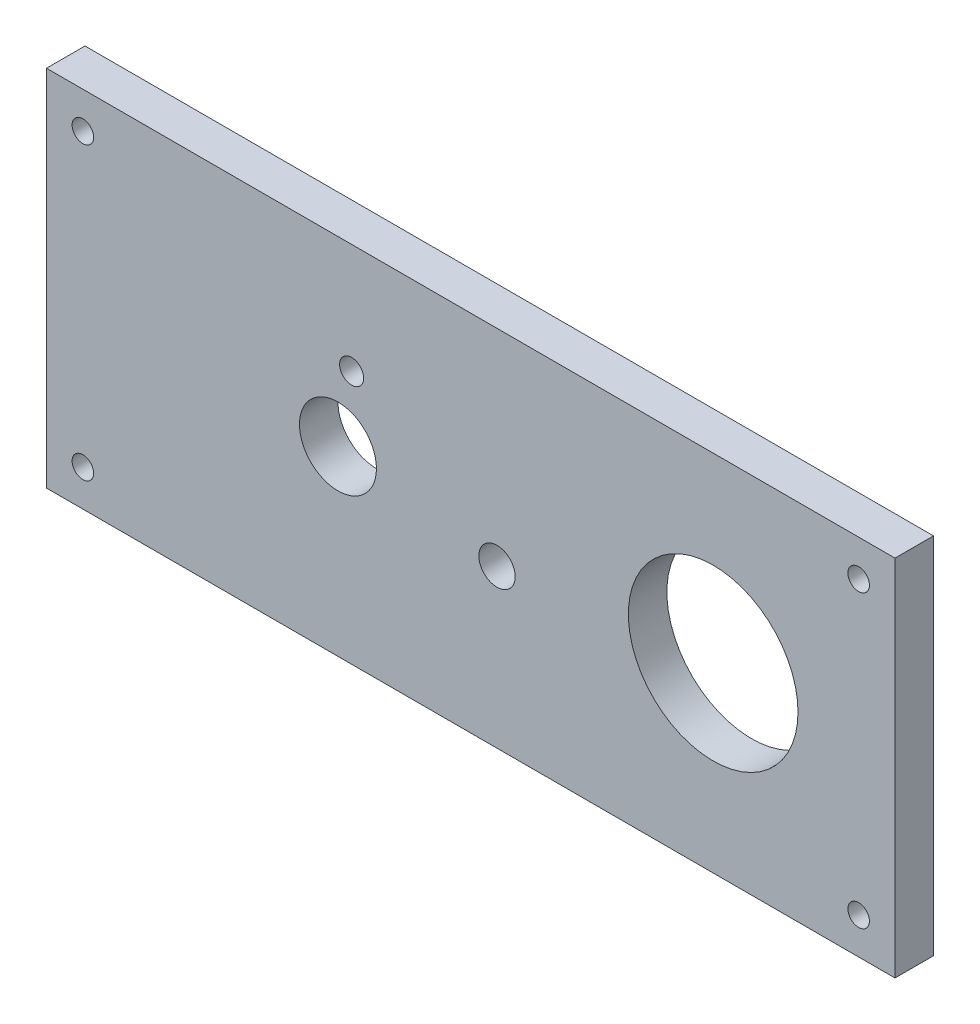
ISO-10303-21;
HEADER;
FILE_DESCRIPTION(('STEP AP214'),'2;1');
FILE_NAME('part.step','',(''),(''),'','','');
FILE_SCHEMA(('AUTOMOTIVE_DESIGN { 1 0 10303 214 1 1 1 1 }'));
ENDSEC;
DATA;
#1=APPLICATION_CONTEXT('core data for automotive mechanical design processes');
#2=APPLICATION_PROTOCOL_DEFINITION('international standard','automotive_design',2000,#1);
#3=PRODUCT_CONTEXT('',#1,'mechanical');
#4=PRODUCT('Part','Part','',(#3));
#5=PRODUCT_RELATED_PRODUCT_CATEGORY('part','',(#4));
#6=PRODUCT_DEFINITION_FORMATION('','',#4);
#7=PRODUCT_DEFINITION_CONTEXT('part definition',#1,'design');
#8=PRODUCT_DEFINITION('design','',#6,#7);
#9=PRODUCT_DEFINITION_SHAPE('','',#8);
#10=(LENGTH_UNIT() NAMED_UNIT(*) SI_UNIT(.MILLI.,.METRE.));
#11=(NAMED_UNIT(*) PLANE_ANGLE_UNIT() SI_UNIT($,.RADIAN.));
#12=(NAMED_UNIT(*) SI_UNIT($,.STERADIAN.) SOLID_ANGLE_UNIT());
#13=UNCERTAINTY_MEASURE_WITH_UNIT(LENGTH_MEASURE(1.E-05),#10,'distance_accuracy_value','');
#14=(GEOMETRIC_REPRESENTATION_CONTEXT(3) GLOBAL_UNCERTAINTY_ASSIGNED_CONTEXT((#13)) GLOBAL_UNIT_ASSIGNED_CONTEXT((#10,
#11,#12)) REPRESENTATION_CONTEXT('',''));
#15=CARTESIAN_POINT('',(0.,0.,0.));
#16=DIRECTION('',(0.,0.,1.));
#17=DIRECTION('',(1.,0.,0.));
#18=AXIS2_PLACEMENT_3D('',#15,#16,#17);
#19=CARTESIAN_POINT('',(0.,0.,3.175));
#20=DIRECTION('',(0.,0.,-1.));
#21=DIRECTION('',(-1.,0.,0.));
#22=AXIS2_PLACEMENT_3D('',#19,#20,#21);
#23=PLANE('',#22);
#24=CARTESIAN_POINT('',(24.0438,15.,3.175));
#25=DIRECTION('',(0.,0.,1.));
#26=DIRECTION('',(1.,0.,0.));
#27=AXIS2_PLACEMENT_3D('',#24,#25,#26);
#28=CIRCLE('',#27,3.175);
#29=CARTESIAN_POINT('',(27.2188,15.,3.175));
#30=VERTEX_POINT('',#29);
#31=EDGE_CURVE('E155',#30,#30,#28,.T.);
#32=ORIENTED_EDGE('',*,*,#31,.F.);
#33=EDGE_LOOP('',(#32));
#34=FACE_BOUND('',#33,.T.);
#35=CARTESIAN_POINT('',(67.,27.,3.175));
#36=DIRECTION('',(0.,0.,1.));
#37=DIRECTION('',(1.,0.,0.));
#38=AXIS2_PLACEMENT_3D('',#35,#36,#37);
#39=CIRCLE('',#38,0.888999999999987);
#40=CARTESIAN_POINT('',(67.889,27.,3.175));
#41=VERTEX_POINT('',#40);
#42=EDGE_CURVE('E151',#41,#41,#39,.T.);
#43=ORIENTED_EDGE('',*,*,#42,.F.);
#44=EDGE_LOOP('',(#43));
#45=FACE_BOUND('',#44,.T.);
#46=CARTESIAN_POINT('',(67.,3.,3.175));
#47=DIRECTION('',(0.,0.,1.));
#48=DIRECTION('',(1.,0.,0.));
#49=AXIS2_PLACEMENT_3D('',#46,#47,#48);
#50=CIRCLE('',#49,0.888999999999987);
#51=CARTESIAN_POINT('',(67.889,3.,3.175));
#52=VERTEX_POINT('',#51);
#53=EDGE_CURVE('E145',#52,#52,#50,.T.);
#54=ORIENTED_EDGE('',*,*,#53,.F.);
#55=EDGE_LOOP('',(#54));
#56=FACE_BOUND('',#55,.T.);
#57=CARTESIAN_POINT('',(3.,27.,3.175));
#58=DIRECTION('',(0.,0.,1.));
#59=DIRECTION('',(1.,0.,0.));
#60=AXIS2_PLACEMENT_3D('',#57,#58,#59);
#61=CIRCLE('',#60,0.888999999999987);
#62=CARTESIAN_POINT('',(3.88899999999999,27.,3.175));
#63=VERTEX_POINT('',#62);
#64=EDGE_CURVE('E139',#63,#63,#61,.T.);
#65=ORIENTED_EDGE('',*,*,#64,.F.);
#66=EDGE_LOOP('',(#65));
#67=FACE_BOUND('',#66,.T.);
#68=CARTESIAN_POINT('',(3.,3.,3.175));
#69=DIRECTION('',(0.,0.,1.));
#70=DIRECTION('',(1.,0.,0.));
#71=AXIS2_PLACEMENT_3D('',#68,#69,#70);
#72=CIRCLE('',#71,0.888999999999987);
#73=CARTESIAN_POINT('',(3.88899999999999,3.,3.175));
#74=VERTEX_POINT('',#73);
#75=EDGE_CURVE('E133',#74,#74,#72,.T.);
#76=ORIENTED_EDGE('',*,*,#75,.F.);
#77=EDGE_LOOP('',(#76));
#78=FACE_BOUND('',#77,.T.);
#79=CARTESIAN_POINT('',(37.1666992956996,13.,3.175));
#80=DIRECTION('',(0.,0.,1.));
#81=DIRECTION('',(1.,0.,0.));
#82=AXIS2_PLACEMENT_3D('',#79,#80,#81);
#83=CIRCLE('',#82,1.49860000000001);
#84=CARTESIAN_POINT('',(38.6652992956997,13.,3.175));
#85=VERTEX_POINT('',#84);
#86=EDGE_CURVE('E116',#85,#85,#83,.T.);
#87=ORIENTED_EDGE('',*,*,#86,.F.);
#88=EDGE_LOOP('',(#87));
#89=FACE_BOUND('',#88,.T.);
#90=DIRECTION('',(0.,-1.,0.));
#91=VECTOR('',#90,1.);
#92=CARTESIAN_POINT('',(0.,0.,3.175));
#93=LINE('',#92,#91);
#94=CARTESIAN_POINT('',(0.,30.,3.175));
#95=VERTEX_POINT('',#94);
#96=CARTESIAN_POINT('',(0.,0.,3.175));
#97=VERTEX_POINT('',#96);
#98=EDGE_CURVE('E86',#95,#97,#93,.T.);
#99=ORIENTED_EDGE('',*,*,#98,.T.);
#100=DIRECTION('',(1.,0.,0.));
#101=VECTOR('',#100,1.);
#102=CARTESIAN_POINT('',(0.,0.,3.175));
#103=LINE('',#102,#101);
#104=CARTESIAN_POINT('',(70.,0.,3.175));
#105=VERTEX_POINT('',#104);
#106=EDGE_CURVE('E81',#97,#105,#103,.T.);
#107=ORIENTED_EDGE('',*,*,#106,.T.);
#108=DIRECTION('',(0.,1.,0.));
#109=VECTOR('',#108,1.);
#110=CARTESIAN_POINT('',(70.,0.,3.175));
#111=LINE('',#110,#109);
#112=CARTESIAN_POINT('',(70.,30.,3.175));
#113=VERTEX_POINT('',#112);
#114=EDGE_CURVE('E84',#105,#113,#111,.T.);
#115=ORIENTED_EDGE('',*,*,#114,.T.);
#116=DIRECTION('',(-1.,0.,0.));
#117=VECTOR('',#116,1.);
#118=CARTESIAN_POINT('',(0.,30.,3.175));
#119=LINE('',#118,#117);
#120=EDGE_CURVE('E51',#113,#95,#119,.T.);
#121=ORIENTED_EDGE('',*,*,#120,.T.);
#122=EDGE_LOOP('',(#99,#107,#115,#121));
#123=FACE_BOUND('',#122,.T.);
#124=CARTESIAN_POINT('',(55.,15.,3.175));
#125=DIRECTION('',(0.,0.,1.));
#126=DIRECTION('',(1.,0.,0.));
#127=AXIS2_PLACEMENT_3D('',#124,#125,#126);
#128=CIRCLE('',#127,6.9977);
#129=CARTESIAN_POINT('',(61.9977,15.,3.175));
#130=VERTEX_POINT('',#129);
#131=EDGE_CURVE('E101',#130,#130,#128,.T.);
#132=ORIENTED_EDGE('',*,*,#131,.F.);
#133=EDGE_LOOP('',(#132));
#134=FACE_BOUND('',#133,.T.);
#135=CARTESIAN_POINT('',(25.1697789659621,20.9334001816327,3.175));
#136=DIRECTION('',(0.,0.,1.));
#137=DIRECTION('',(1.,0.,0.));
#138=AXIS2_PLACEMENT_3D('',#135,#136,#137);
#139=CIRCLE('',#138,0.990600000000001);
#140=CARTESIAN_POINT('',(26.1603789659621,20.9334001816327,3.175));
#141=VERTEX_POINT('',#140);
#142=EDGE_CURVE('E122',#141,#141,#139,.T.);
#143=ORIENTED_EDGE('',*,*,#142,.F.);
#144=EDGE_LOOP('',(#143));
#145=FACE_BOUND('',#144,.T.);
#146=ADVANCED_FACE('F34',(#34,#45,#56,#67,#78,#89,#123,#134,#145),#23,.F.);
#147=CARTESIAN_POINT('',(0.,0.,0.));
#148=DIRECTION('',(0.,0.,-1.));
#149=DIRECTION('',(-1.,0.,0.));
#150=AXIS2_PLACEMENT_3D('',#147,#148,#149);
#151=PLANE('',#150);
#152=CARTESIAN_POINT('',(24.0438,15.,0.));
#153=DIRECTION('',(0.,0.,1.));
#154=DIRECTION('',(1.,0.,0.));
#155=AXIS2_PLACEMENT_3D('',#152,#153,#154);
#156=CIRCLE('',#155,3.175);
#157=CARTESIAN_POINT('',(27.2188,15.,0.));
#158=VERTEX_POINT('',#157);
#159=EDGE_CURVE('E154',#158,#158,#156,.T.);
#160=ORIENTED_EDGE('',*,*,#159,.T.);
#161=EDGE_LOOP('',(#160));
#162=FACE_BOUND('',#161,.T.);
#163=CARTESIAN_POINT('',(67.,27.,0.));
#164=DIRECTION('',(0.,0.,1.));
#165=DIRECTION('',(1.,0.,0.));
#166=AXIS2_PLACEMENT_3D('',#163,#164,#165);
#167=CIRCLE('',#166,0.889000000000001);
#168=CARTESIAN_POINT('',(67.889,27.,0.));
#169=VERTEX_POINT('',#168);
#170=EDGE_CURVE('E148',#169,#169,#167,.T.);
#171=ORIENTED_EDGE('',*,*,#170,.T.);
#172=EDGE_LOOP('',(#171));
#173=FACE_BOUND('',#172,.T.);
#174=CARTESIAN_POINT('',(67.,3.,0.));
#175=DIRECTION('',(0.,0.,1.));
#176=DIRECTION('',(1.,0.,0.));
#177=AXIS2_PLACEMENT_3D('',#174,#175,#176);
#178=CIRCLE('',#177,0.889000000000001);
#179=CARTESIAN_POINT('',(67.889,3.,0.));
#180=VERTEX_POINT('',#179);
#181=EDGE_CURVE('E142',#180,#180,#178,.T.);
#182=ORIENTED_EDGE('',*,*,#181,.T.);
#183=EDGE_LOOP('',(#182));
#184=FACE_BOUND('',#183,.T.);
#185=CARTESIAN_POINT('',(3.,27.,0.));
#186=DIRECTION('',(0.,0.,1.));
#187=DIRECTION('',(1.,0.,0.));
#188=AXIS2_PLACEMENT_3D('',#185,#186,#187);
#189=CIRCLE('',#188,0.888999999999999);
#190=CARTESIAN_POINT('',(3.889,27.,0.));
#191=VERTEX_POINT('',#190);
#192=EDGE_CURVE('E136',#191,#191,#189,.T.);
#193=ORIENTED_EDGE('',*,*,#192,.T.);
#194=EDGE_LOOP('',(#193));
#195=FACE_BOUND('',#194,.T.);
#196=CARTESIAN_POINT('',(3.,3.,0.));
#197=DIRECTION('',(0.,0.,1.));
#198=DIRECTION('',(1.,0.,0.));
#199=AXIS2_PLACEMENT_3D('',#196,#197,#198);
#200=CIRCLE('',#199,0.888999999999999);
#201=CARTESIAN_POINT('',(3.889,3.,0.));
#202=VERTEX_POINT('',#201);
#203=EDGE_CURVE('E128',#202,#202,#200,.T.);
#204=ORIENTED_EDGE('',*,*,#203,.T.);
#205=EDGE_LOOP('',(#204));
#206=FACE_BOUND('',#205,.T.);
#207=CARTESIAN_POINT('',(37.1666992956996,13.,0.));
#208=DIRECTION('',(0.,0.,1.));
#209=DIRECTION('',(1.,0.,0.));
#210=AXIS2_PLACEMENT_3D('',#207,#208,#209);
#211=CIRCLE('',#210,1.49860000000001);
#212=CARTESIAN_POINT('',(38.6652992956997,13.,0.));
#213=VERTEX_POINT('',#212);
#214=EDGE_CURVE('E119',#213,#213,#211,.T.);
#215=ORIENTED_EDGE('',*,*,#214,.T.);
#216=EDGE_LOOP('',(#215));
#217=FACE_BOUND('',#216,.T.);
#218=DIRECTION('',(0.,-1.,0.));
#219=VECTOR('',#218,1.);
#220=CARTESIAN_POINT('',(0.,0.,0.));
#221=LINE('',#220,#219);
#222=CARTESIAN_POINT('',(0.,30.,0.));
#223=VERTEX_POINT('',#222);
#224=CARTESIAN_POINT('',(0.,0.,0.));
#225=VERTEX_POINT('',#224);
#226=EDGE_CURVE('E98',#223,#225,#221,.T.);
#227=ORIENTED_EDGE('',*,*,#226,.F.);
#228=DIRECTION('',(-1.,0.,0.));
#229=VECTOR('',#228,1.);
#230=CARTESIAN_POINT('',(0.,30.,0.));
#231=LINE('',#230,#229);
#232=CARTESIAN_POINT('',(70.,30.,0.));
#233=VERTEX_POINT('',#232);
#234=EDGE_CURVE('E74',#233,#223,#231,.T.);
#235=ORIENTED_EDGE('',*,*,#234,.F.);
#236=DIRECTION('',(0.,1.,0.));
#237=VECTOR('',#236,1.);
#238=CARTESIAN_POINT('',(70.,0.,0.));
#239=LINE('',#238,#237);
#240=CARTESIAN_POINT('',(70.,0.,0.));
#241=VERTEX_POINT('',#240);
#242=EDGE_CURVE('E68',#241,#233,#239,.T.);
#243=ORIENTED_EDGE('',*,*,#242,.F.);
#244=DIRECTION('',(1.,0.,0.));
#245=VECTOR('',#244,1.);
#246=CARTESIAN_POINT('',(0.,0.,0.));
#247=LINE('',#246,#245);
#248=EDGE_CURVE('E90',#225,#241,#247,.T.);
#249=ORIENTED_EDGE('',*,*,#248,.F.);
#250=EDGE_LOOP('',(#227,#235,#243,#249));
#251=FACE_BOUND('',#250,.T.);
#252=CARTESIAN_POINT('',(55.,15.,0.));
#253=DIRECTION('',(0.,0.,1.));
#254=DIRECTION('',(1.,0.,0.));
#255=AXIS2_PLACEMENT_3D('',#252,#253,#254);
#256=CIRCLE('',#255,6.9977);
#257=CARTESIAN_POINT('',(61.9977,15.,0.));
#258=VERTEX_POINT('',#257);
#259=EDGE_CURVE('E113',#258,#258,#256,.T.);
#260=ORIENTED_EDGE('',*,*,#259,.T.);
#261=EDGE_LOOP('',(#260));
#262=FACE_BOUND('',#261,.T.);
#263=CARTESIAN_POINT('',(25.1697789659621,20.9334001816327,0.));
#264=DIRECTION('',(0.,0.,1.));
#265=DIRECTION('',(1.,0.,0.));
#266=AXIS2_PLACEMENT_3D('',#263,#264,#265);
#267=CIRCLE('',#266,0.990600000000001);
#268=CARTESIAN_POINT('',(26.1603789659621,20.9334001816327,0.));
#269=VERTEX_POINT('',#268);
#270=EDGE_CURVE('E125',#269,#269,#267,.T.);
#271=ORIENTED_EDGE('',*,*,#270,.T.);
#272=EDGE_LOOP('',(#271));
#273=FACE_BOUND('',#272,.T.);
#274=ADVANCED_FACE('F109',(#162,#173,#184,#195,#206,#217,#251,#262,#273),#151,.T.);
#275=CARTESIAN_POINT('',(0.,0.,3.175));
#276=DIRECTION('',(1.,0.,0.));
#277=DIRECTION('',(0.,0.,-1.));
#278=AXIS2_PLACEMENT_3D('',#275,#276,#277);
#279=PLANE('',#278);
#280=ORIENTED_EDGE('',*,*,#226,.T.);
#281=DIRECTION('',(0.,0.,-1.));
#282=VECTOR('',#281,1.);
#283=CARTESIAN_POINT('',(0.,0.,3.175));
#284=LINE('',#283,#282);
#285=EDGE_CURVE('E11',#97,#225,#284,.T.);
#286=ORIENTED_EDGE('',*,*,#285,.F.);
#287=ORIENTED_EDGE('',*,*,#98,.F.);
#288=DIRECTION('',(0.,0.,-1.));
#289=VECTOR('',#288,1.);
#290=CARTESIAN_POINT('',(0.,30.,3.175));
#291=LINE('',#290,#289);
#292=EDGE_CURVE('E94',#95,#223,#291,.T.);
#293=ORIENTED_EDGE('',*,*,#292,.T.);
#294=EDGE_LOOP('',(#280,#286,#287,#293));
#295=FACE_BOUND('',#294,.T.);
#296=ADVANCED_FACE('F36',(#295),#279,.F.);
#297=CARTESIAN_POINT('',(0.,0.,3.175));
#298=DIRECTION('',(0.,1.,0.));
#299=DIRECTION('',(0.,0.,1.));
#300=AXIS2_PLACEMENT_3D('',#297,#298,#299);
#301=PLANE('',#300);
#302=ORIENTED_EDGE('',*,*,#248,.T.);
#303=DIRECTION('',(0.,0.,-1.));
#304=VECTOR('',#303,1.);
#305=CARTESIAN_POINT('',(70.,0.,3.175));
#306=LINE('',#305,#304);
#307=EDGE_CURVE('E43',#105,#241,#306,.T.);
#308=ORIENTED_EDGE('',*,*,#307,.F.);
#309=ORIENTED_EDGE('',*,*,#106,.F.);
#310=ORIENTED_EDGE('',*,*,#285,.T.);
#311=EDGE_LOOP('',(#302,#308,#309,#310));
#312=FACE_BOUND('',#311,.T.);
#313=ADVANCED_FACE('F89',(#312),#301,.F.);
#314=CARTESIAN_POINT('',(70.,0.,3.175));
#315=DIRECTION('',(-1.,0.,0.));
#316=DIRECTION('',(0.,0.,1.));
#317=AXIS2_PLACEMENT_3D('',#314,#315,#316);
#318=PLANE('',#317);
#319=ORIENTED_EDGE('',*,*,#242,.T.);
#320=DIRECTION('',(0.,0.,-1.));
#321=VECTOR('',#320,1.);
#322=CARTESIAN_POINT('',(70.,30.,3.175));
#323=LINE('',#322,#321);
#324=EDGE_CURVE('E91',#113,#233,#323,.T.);
#325=ORIENTED_EDGE('',*,*,#324,.F.);
#326=ORIENTED_EDGE('',*,*,#114,.F.);
#327=ORIENTED_EDGE('',*,*,#307,.T.);
#328=EDGE_LOOP('',(#319,#325,#326,#327));
#329=FACE_BOUND('',#328,.T.);
#330=ADVANCED_FACE('F92',(#329),#318,.F.);
#331=CARTESIAN_POINT('',(0.,30.,3.175));
#332=DIRECTION('',(0.,-1.,0.));
#333=DIRECTION('',(0.,0.,-1.));
#334=AXIS2_PLACEMENT_3D('',#331,#332,#333);
#335=PLANE('',#334);
#336=ORIENTED_EDGE('',*,*,#234,.T.);
#337=ORIENTED_EDGE('',*,*,#292,.F.);
#338=ORIENTED_EDGE('',*,*,#120,.F.);
#339=ORIENTED_EDGE('',*,*,#324,.T.);
#340=EDGE_LOOP('',(#336,#337,#338,#339));
#341=FACE_BOUND('',#340,.T.);
#342=ADVANCED_FACE('F106',(#341),#335,.F.);
#343=CARTESIAN_POINT('',(55.,15.,3.175));
#344=DIRECTION('',(0.,0.,-1.));
#345=DIRECTION('',(-1.,0.,0.));
#346=AXIS2_PLACEMENT_3D('',#343,#344,#345);
#347=CYLINDRICAL_SURFACE('',#346,6.9977);
#348=ORIENTED_EDGE('',*,*,#131,.T.);
#349=EDGE_LOOP('',(#348));
#350=FACE_BOUND('',#349,.T.);
#351=ORIENTED_EDGE('',*,*,#259,.F.);
#352=EDGE_LOOP('',(#351));
#353=FACE_BOUND('',#352,.T.);
#354=ADVANCED_FACE('F187',(#350,#353),#347,.F.);
#355=CARTESIAN_POINT('',(37.1666992956996,13.,3.175));
#356=DIRECTION('',(0.,0.,-1.));
#357=DIRECTION('',(-1.,0.,0.));
#358=AXIS2_PLACEMENT_3D('',#355,#356,#357);
#359=CYLINDRICAL_SURFACE('',#358,1.49860000000001);
#360=ORIENTED_EDGE('',*,*,#86,.T.);
#361=EDGE_LOOP('',(#360));
#362=FACE_BOUND('',#361,.T.);
#363=ORIENTED_EDGE('',*,*,#214,.F.);
#364=EDGE_LOOP('',(#363));
#365=FACE_BOUND('',#364,.T.);
#366=ADVANCED_FACE('F183',(#362,#365),#359,.F.);
#367=CARTESIAN_POINT('',(25.1697789659621,20.9334001816327,3.175));
#368=DIRECTION('',(0.,0.,-1.));
#369=DIRECTION('',(-1.,0.,0.));
#370=AXIS2_PLACEMENT_3D('',#367,#368,#369);
#371=CYLINDRICAL_SURFACE('',#370,0.990600000000001);
#372=ORIENTED_EDGE('',*,*,#142,.T.);
#373=EDGE_LOOP('',(#372));
#374=FACE_BOUND('',#373,.T.);
#375=ORIENTED_EDGE('',*,*,#270,.F.);
#376=EDGE_LOOP('',(#375));
#377=FACE_BOUND('',#376,.T.);
#378=ADVANCED_FACE('F186',(#374,#377),#371,.F.);
#379=CARTESIAN_POINT('',(3.,3.,3.175));
#380=DIRECTION('',(0.,0.,1.));
#381=DIRECTION('',(1.,0.,0.));
#382=AXIS2_PLACEMENT_3D('',#379,#380,#381);
#383=CYLINDRICAL_SURFACE('',#382,0.888999999999993);
#384=ORIENTED_EDGE('',*,*,#203,.F.);
#385=EDGE_LOOP('',(#384));
#386=FACE_BOUND('',#385,.T.);
#387=ORIENTED_EDGE('',*,*,#75,.T.);
#388=EDGE_LOOP('',(#387));
#389=FACE_BOUND('',#388,.T.);
#390=ADVANCED_FACE('F231',(#386,#389),#383,.F.);
#391=CARTESIAN_POINT('',(3.,27.,3.175));
#392=DIRECTION('',(0.,0.,1.));
#393=DIRECTION('',(1.,0.,0.));
#394=AXIS2_PLACEMENT_3D('',#391,#392,#393);
#395=CYLINDRICAL_SURFACE('',#394,0.888999999999993);
#396=ORIENTED_EDGE('',*,*,#192,.F.);
#397=EDGE_LOOP('',(#396));
#398=FACE_BOUND('',#397,.T.);
#399=ORIENTED_EDGE('',*,*,#64,.T.);
#400=EDGE_LOOP('',(#399));
#401=FACE_BOUND('',#400,.T.);
#402=ADVANCED_FACE('F239',(#398,#401),#395,.F.);
#403=CARTESIAN_POINT('',(67.,3.,3.175));
#404=DIRECTION('',(0.,0.,1.));
#405=DIRECTION('',(1.,0.,0.));
#406=AXIS2_PLACEMENT_3D('',#403,#404,#405);
#407=CYLINDRICAL_SURFACE('',#406,0.888999999999994);
#408=ORIENTED_EDGE('',*,*,#181,.F.);
#409=EDGE_LOOP('',(#408));
#410=FACE_BOUND('',#409,.T.);
#411=ORIENTED_EDGE('',*,*,#53,.T.);
#412=EDGE_LOOP('',(#411));
#413=FACE_BOUND('',#412,.T.);
#414=ADVANCED_FACE('F247',(#410,#413),#407,.F.);
#415=CARTESIAN_POINT('',(67.,27.,3.175));
#416=DIRECTION('',(0.,0.,1.));
#417=DIRECTION('',(1.,0.,0.));
#418=AXIS2_PLACEMENT_3D('',#415,#416,#417);
#419=CYLINDRICAL_SURFACE('',#418,0.888999999999994);
#420=ORIENTED_EDGE('',*,*,#170,.F.);
#421=EDGE_LOOP('',(#420));
#422=FACE_BOUND('',#421,.T.);
#423=ORIENTED_EDGE('',*,*,#42,.T.);
#424=EDGE_LOOP('',(#423));
#425=FACE_BOUND('',#424,.T.);
#426=ADVANCED_FACE('F166',(#422,#425),#419,.F.);
#427=CARTESIAN_POINT('',(24.0438,15.,0.));
#428=DIRECTION('',(0.,0.,1.));
#429=DIRECTION('',(1.,0.,0.));
#430=AXIS2_PLACEMENT_3D('',#427,#428,#429);
#431=CYLINDRICAL_SURFACE('',#430,3.175);
#432=ORIENTED_EDGE('',*,*,#159,.F.);
#433=EDGE_LOOP('',(#432));
#434=FACE_BOUND('',#433,.T.);
#435=ORIENTED_EDGE('',*,*,#31,.T.);
#436=EDGE_LOOP('',(#435));
#437=FACE_BOUND('',#436,.T.);
#438=ADVANCED_FACE('F163',(#434,#437),#431,.F.);
#439=CLOSED_SHELL('',(#146,#274,#296,#313,#330,#342,#354,#366,#378,#390,#402,#414,#426,#438));
#440=MANIFOLD_SOLID_BREP('B2',#439);
#441=ADVANCED_BREP_SHAPE_REPRESENTATION('',(#18,#440),#14);
#442=SHAPE_DEFINITION_REPRESENTATION(#9,#441);
ENDSEC;
END-ISO-10303-21;
